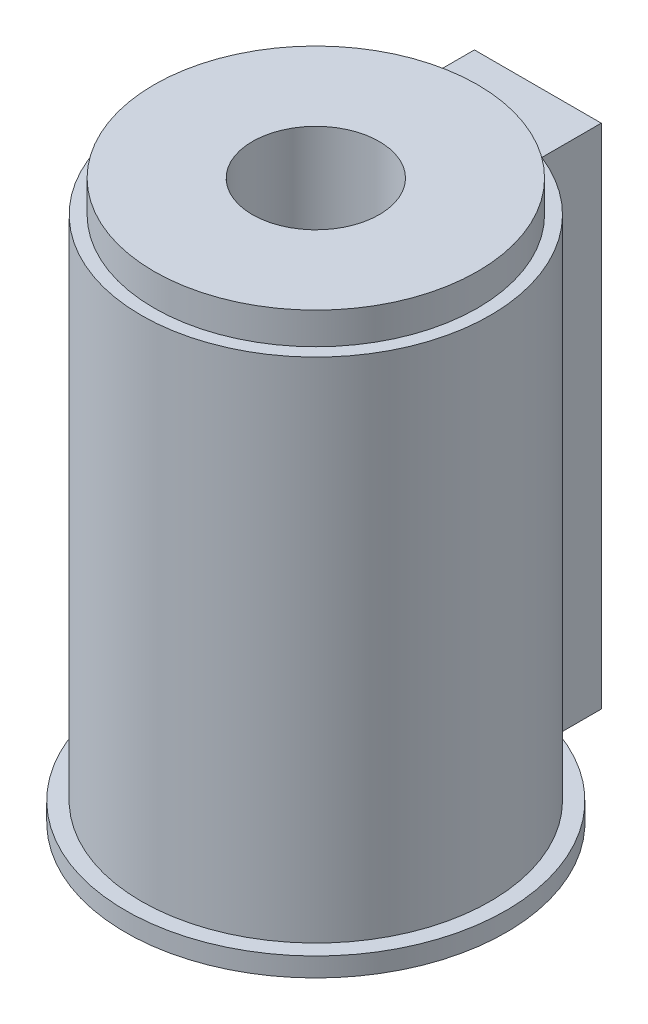
ISO-10303-21;
HEADER;
FILE_DESCRIPTION(('STEP AP214'),'2;1');
FILE_NAME('part.step','',(''),(''),'','','');
FILE_SCHEMA(('AUTOMOTIVE_DESIGN { 1 0 10303 214 1 1 1 1 }'));
ENDSEC;
DATA;
#1=APPLICATION_CONTEXT('core data for automotive mechanical design processes');
#2=APPLICATION_PROTOCOL_DEFINITION('international standard','automotive_design',2000,#1);
#3=PRODUCT_CONTEXT('',#1,'mechanical');
#4=PRODUCT('Part','Part','',(#3));
#5=PRODUCT_RELATED_PRODUCT_CATEGORY('part','',(#4));
#6=PRODUCT_DEFINITION_FORMATION('','',#4);
#7=PRODUCT_DEFINITION_CONTEXT('part definition',#1,'design');
#8=PRODUCT_DEFINITION('design','',#6,#7);
#9=PRODUCT_DEFINITION_SHAPE('','',#8);
#10=(LENGTH_UNIT() NAMED_UNIT(*) SI_UNIT(.MILLI.,.METRE.));
#11=(NAMED_UNIT(*) PLANE_ANGLE_UNIT() SI_UNIT($,.RADIAN.));
#12=(NAMED_UNIT(*) SI_UNIT($,.STERADIAN.) SOLID_ANGLE_UNIT());
#13=UNCERTAINTY_MEASURE_WITH_UNIT(LENGTH_MEASURE(1.E-05),#10,'distance_accuracy_value','');
#14=(GEOMETRIC_REPRESENTATION_CONTEXT(3) GLOBAL_UNCERTAINTY_ASSIGNED_CONTEXT((#13)) GLOBAL_UNIT_ASSIGNED_CONTEXT((#10,
#11,#12)) REPRESENTATION_CONTEXT('',''));
#15=CARTESIAN_POINT('',(0.,0.,0.));
#16=DIRECTION('',(0.,0.,1.));
#17=DIRECTION('',(1.,0.,0.));
#18=AXIS2_PLACEMENT_3D('',#15,#16,#17);
#19=CARTESIAN_POINT('',(0.,800.,0.));
#20=DIRECTION('',(0.,-1.,0.));
#21=DIRECTION('',(0.,0.,-1.));
#22=AXIS2_PLACEMENT_3D('',#19,#20,#21);
#23=CYLINDRICAL_SURFACE('',#22,275.);
#24=CARTESIAN_POINT('',(0.,0.,0.));
#25=DIRECTION('',(0.,1.,0.));
#26=DIRECTION('',(0.,0.,1.));
#27=AXIS2_PLACEMENT_3D('',#24,#25,#26);
#28=CIRCLE('',#27,275.);
#29=CARTESIAN_POINT('',(-100.,0.,-256.17376914899));
#30=VERTEX_POINT('',#29);
#31=CARTESIAN_POINT('',(100.,0.,-256.17376914899));
#32=VERTEX_POINT('',#31);
#33=EDGE_CURVE('E129',#30,#32,#28,.T.);
#34=ORIENTED_EDGE('',*,*,#33,.T.);
#35=DIRECTION('',(0.,-1.,0.));
#36=VECTOR('',#35,1.);
#37=CARTESIAN_POINT('',(100.,800.,-256.17376914899));
#38=LINE('',#37,#36);
#39=CARTESIAN_POINT('',(100.,800.,-256.17376914899));
#40=VERTEX_POINT('',#39);
#41=EDGE_CURVE('E93',#40,#32,#38,.T.);
#42=ORIENTED_EDGE('',*,*,#41,.F.);
#43=CARTESIAN_POINT('',(0.,800.,0.));
#44=DIRECTION('',(0.,1.,0.));
#45=DIRECTION('',(0.,0.,1.));
#46=AXIS2_PLACEMENT_3D('',#43,#44,#45);
#47=CIRCLE('',#46,275.);
#48=CARTESIAN_POINT('',(-100.,800.,-256.17376914899));
#49=VERTEX_POINT('',#48);
#50=EDGE_CURVE('E42',#49,#40,#47,.T.);
#51=ORIENTED_EDGE('',*,*,#50,.F.);
#52=DIRECTION('',(0.,-1.,0.));
#53=VECTOR('',#52,1.);
#54=CARTESIAN_POINT('',(-100.,800.,-256.17376914899));
#55=LINE('',#54,#53);
#56=EDGE_CURVE('E119',#49,#30,#55,.T.);
#57=ORIENTED_EDGE('',*,*,#56,.T.);
#58=EDGE_LOOP('',(#34,#42,#51,#57));
#59=FACE_BOUND('',#58,.T.);
#60=ADVANCED_FACE('F34',(#59),#23,.T.);
#61=CARTESIAN_POINT('',(0.,800.,0.));
#62=DIRECTION('',(0.,1.,0.));
#63=DIRECTION('',(0.,0.,1.));
#64=AXIS2_PLACEMENT_3D('',#61,#62,#63);
#65=PLANE('',#64);
#66=CARTESIAN_POINT('',(0.,800.,0.));
#67=DIRECTION('',(0.,1.,0.));
#68=DIRECTION('',(0.,0.,1.));
#69=AXIS2_PLACEMENT_3D('',#66,#67,#68);
#70=CIRCLE('',#69,255.);
#71=CARTESIAN_POINT('',(0.,800.,255.));
#72=VERTEX_POINT('',#71);
#73=EDGE_CURVE('E108',#72,#72,#70,.T.);
#74=ORIENTED_EDGE('',*,*,#73,.F.);
#75=EDGE_LOOP('',(#74));
#76=FACE_BOUND('',#75,.T.);
#77=ORIENTED_EDGE('',*,*,#50,.T.);
#78=DIRECTION('',(0.,0.,1.));
#79=VECTOR('',#78,1.);
#80=CARTESIAN_POINT('',(99.9999999999999,800.,0.));
#81=LINE('',#80,#79);
#82=CARTESIAN_POINT('',(100.,800.,-350.));
#83=VERTEX_POINT('',#82);
#84=EDGE_CURVE('E112',#83,#40,#81,.T.);
#85=ORIENTED_EDGE('',*,*,#84,.F.);
#86=DIRECTION('',(1.,0.,0.));
#87=VECTOR('',#86,1.);
#88=CARTESIAN_POINT('',(0.,800.,-350.));
#89=LINE('',#88,#87);
#90=CARTESIAN_POINT('',(-100.,800.,-350.));
#91=VERTEX_POINT('',#90);
#92=EDGE_CURVE('E114',#91,#83,#89,.T.);
#93=ORIENTED_EDGE('',*,*,#92,.F.);
#94=DIRECTION('',(0.,0.,1.));
#95=VECTOR('',#94,1.);
#96=CARTESIAN_POINT('',(-99.9999999999999,800.,0.));
#97=LINE('',#96,#95);
#98=EDGE_CURVE('E118',#91,#49,#97,.T.);
#99=ORIENTED_EDGE('',*,*,#98,.T.);
#100=EDGE_LOOP('',(#77,#85,#93,#99));
#101=FACE_BOUND('',#100,.T.);
#102=ADVANCED_FACE('F139',(#76,#101),#65,.T.);
#103=CARTESIAN_POINT('',(0.,0.,0.));
#104=DIRECTION('',(0.,1.,0.));
#105=DIRECTION('',(0.,0.,1.));
#106=AXIS2_PLACEMENT_3D('',#103,#104,#105);
#107=PLANE('',#106);
#108=CARTESIAN_POINT('',(0.,0.,0.));
#109=DIRECTION('',(0.,-1.,0.));
#110=DIRECTION('',(0.,0.,-1.));
#111=AXIS2_PLACEMENT_3D('',#108,#109,#110);
#112=CIRCLE('',#111,300.);
#113=CARTESIAN_POINT('',(-100.,0.,-282.842712474619));
#114=VERTEX_POINT('',#113);
#115=CARTESIAN_POINT('',(100.,0.,-282.842712474619));
#116=VERTEX_POINT('',#115);
#117=EDGE_CURVE('E11',#114,#116,#112,.T.);
#118=ORIENTED_EDGE('',*,*,#117,.F.);
#119=DIRECTION('',(0.,0.,1.));
#120=VECTOR('',#119,1.);
#121=CARTESIAN_POINT('',(-99.9999999999999,0.,0.));
#122=LINE('',#121,#120);
#123=CARTESIAN_POINT('',(-100.,0.,-350.));
#124=VERTEX_POINT('',#123);
#125=EDGE_CURVE('E115',#124,#114,#122,.T.);
#126=ORIENTED_EDGE('',*,*,#125,.F.);
#127=DIRECTION('',(1.,0.,0.));
#128=VECTOR('',#127,1.);
#129=CARTESIAN_POINT('',(0.,0.,-350.));
#130=LINE('',#129,#128);
#131=CARTESIAN_POINT('',(100.,0.,-350.));
#132=VERTEX_POINT('',#131);
#133=EDGE_CURVE('E85',#124,#132,#130,.T.);
#134=ORIENTED_EDGE('',*,*,#133,.T.);
#135=DIRECTION('',(0.,0.,1.));
#136=VECTOR('',#135,1.);
#137=CARTESIAN_POINT('',(99.9999999999999,0.,0.));
#138=LINE('',#137,#136);
#139=EDGE_CURVE('E81',#132,#116,#138,.T.);
#140=ORIENTED_EDGE('',*,*,#139,.T.);
#141=EDGE_LOOP('',(#118,#126,#134,#140));
#142=FACE_BOUND('',#141,.T.);
#143=ADVANCED_FACE('F83',(#142),#107,.F.);
#144=CARTESIAN_POINT('',(99.9999999999999,800.,0.));
#145=DIRECTION('',(1.,0.,0.));
#146=DIRECTION('',(0.,0.,-1.));
#147=AXIS2_PLACEMENT_3D('',#144,#145,#146);
#148=PLANE('',#147);
#149=ORIENTED_EDGE('',*,*,#139,.F.);
#150=DIRECTION('',(0.,-1.,0.));
#151=VECTOR('',#150,1.);
#152=CARTESIAN_POINT('',(100.,800.,-350.));
#153=LINE('',#152,#151);
#154=EDGE_CURVE('E126',#83,#132,#153,.T.);
#155=ORIENTED_EDGE('',*,*,#154,.F.);
#156=ORIENTED_EDGE('',*,*,#84,.T.);
#157=ORIENTED_EDGE('',*,*,#41,.T.);
#158=EDGE_CURVE('E87',#116,#32,#138,.T.);
#159=ORIENTED_EDGE('',*,*,#158,.F.);
#160=EDGE_LOOP('',(#149,#155,#156,#157,#159));
#161=FACE_BOUND('',#160,.T.);
#162=ADVANCED_FACE('F91',(#161),#148,.T.);
#163=CARTESIAN_POINT('',(0.,800.,-350.));
#164=DIRECTION('',(0.,0.,-1.));
#165=DIRECTION('',(-1.,0.,0.));
#166=AXIS2_PLACEMENT_3D('',#163,#164,#165);
#167=PLANE('',#166);
#168=ORIENTED_EDGE('',*,*,#133,.F.);
#169=DIRECTION('',(0.,-1.,0.));
#170=VECTOR('',#169,1.);
#171=CARTESIAN_POINT('',(-100.,800.,-350.));
#172=LINE('',#171,#170);
#173=EDGE_CURVE('E124',#91,#124,#172,.T.);
#174=ORIENTED_EDGE('',*,*,#173,.F.);
#175=ORIENTED_EDGE('',*,*,#92,.T.);
#176=ORIENTED_EDGE('',*,*,#154,.T.);
#177=EDGE_LOOP('',(#168,#174,#175,#176));
#178=FACE_BOUND('',#177,.T.);
#179=ADVANCED_FACE('F136',(#178),#167,.T.);
#180=CARTESIAN_POINT('',(-99.9999999999999,800.,0.));
#181=DIRECTION('',(1.,0.,0.));
#182=DIRECTION('',(0.,0.,-1.));
#183=AXIS2_PLACEMENT_3D('',#180,#181,#182);
#184=PLANE('',#183);
#185=ORIENTED_EDGE('',*,*,#125,.T.);
#186=EDGE_CURVE('E103',#114,#30,#122,.T.);
#187=ORIENTED_EDGE('',*,*,#186,.T.);
#188=ORIENTED_EDGE('',*,*,#56,.F.);
#189=ORIENTED_EDGE('',*,*,#98,.F.);
#190=ORIENTED_EDGE('',*,*,#173,.T.);
#191=EDGE_LOOP('',(#185,#187,#188,#189,#190));
#192=FACE_BOUND('',#191,.T.);
#193=ADVANCED_FACE('F133',(#192),#184,.F.);
#194=CARTESIAN_POINT('',(0.,-30.,0.));
#195=DIRECTION('',(0.,1.,0.));
#196=DIRECTION('',(0.,0.,1.));
#197=AXIS2_PLACEMENT_3D('',#194,#195,#196);
#198=CYLINDRICAL_SURFACE('',#197,300.);
#199=CARTESIAN_POINT('',(0.,-30.,0.));
#200=DIRECTION('',(0.,-1.,0.));
#201=DIRECTION('',(0.,0.,-1.));
#202=AXIS2_PLACEMENT_3D('',#199,#200,#201);
#203=CIRCLE('',#202,300.);
#204=CARTESIAN_POINT('',(0.,-30.,-300.));
#205=VERTEX_POINT('',#204);
#206=EDGE_CURVE('E97',#205,#205,#203,.T.);
#207=ORIENTED_EDGE('',*,*,#206,.F.);
#208=EDGE_LOOP('',(#207));
#209=FACE_BOUND('',#208,.T.);
#210=EDGE_CURVE('E44',#116,#114,#112,.T.);
#211=ORIENTED_EDGE('',*,*,#210,.T.);
#212=ORIENTED_EDGE('',*,*,#117,.T.);
#213=EDGE_LOOP('',(#211,#212));
#214=FACE_BOUND('',#213,.T.);
#215=ADVANCED_FACE('F100',(#209,#214),#198,.T.);
#216=CARTESIAN_POINT('',(0.,-30.,0.));
#217=DIRECTION('',(0.,-1.,0.));
#218=DIRECTION('',(0.,0.,-1.));
#219=AXIS2_PLACEMENT_3D('',#216,#217,#218);
#220=PLANE('',#219);
#221=CARTESIAN_POINT('',(0.,-30.,0.));
#222=DIRECTION('',(0.,1.,0.));
#223=DIRECTION('',(0.,0.,1.));
#224=AXIS2_PLACEMENT_3D('',#221,#222,#223);
#225=CIRCLE('',#224,100.);
#226=CARTESIAN_POINT('',(0.,-30.,100.));
#227=VERTEX_POINT('',#226);
#228=EDGE_CURVE('E182',#227,#227,#225,.T.);
#229=ORIENTED_EDGE('',*,*,#228,.T.);
#230=EDGE_LOOP('',(#229));
#231=FACE_BOUND('',#230,.T.);
#232=ORIENTED_EDGE('',*,*,#206,.T.);
#233=EDGE_LOOP('',(#232));
#234=FACE_BOUND('',#233,.T.);
#235=ADVANCED_FACE('F157',(#231,#234),#220,.T.);
#236=CARTESIAN_POINT('',(0.,0.,0.));
#237=DIRECTION('',(0.,-1.,0.));
#238=DIRECTION('',(0.,0.,-1.));
#239=AXIS2_PLACEMENT_3D('',#236,#237,#238);
#240=PLANE('',#239);
#241=ORIENTED_EDGE('',*,*,#186,.F.);
#242=ORIENTED_EDGE('',*,*,#210,.F.);
#243=ORIENTED_EDGE('',*,*,#158,.T.);
#244=ORIENTED_EDGE('',*,*,#33,.F.);
#245=EDGE_LOOP('',(#241,#242,#243,#244));
#246=FACE_BOUND('',#245,.T.);
#247=ADVANCED_FACE('F102',(#246),#240,.F.);
#248=CARTESIAN_POINT('',(0.,850.,0.));
#249=DIRECTION('',(0.,-1.,0.));
#250=DIRECTION('',(0.,0.,-1.));
#251=AXIS2_PLACEMENT_3D('',#248,#249,#250);
#252=CYLINDRICAL_SURFACE('',#251,255.);
#253=CARTESIAN_POINT('',(0.,850.,0.));
#254=DIRECTION('',(0.,1.,0.));
#255=DIRECTION('',(0.,0.,1.));
#256=AXIS2_PLACEMENT_3D('',#253,#254,#255);
#257=CIRCLE('',#256,255.);
#258=CARTESIAN_POINT('',(0.,850.,255.));
#259=VERTEX_POINT('',#258);
#260=EDGE_CURVE('E104',#259,#259,#257,.T.);
#261=ORIENTED_EDGE('',*,*,#260,.F.);
#262=EDGE_LOOP('',(#261));
#263=FACE_BOUND('',#262,.T.);
#264=ORIENTED_EDGE('',*,*,#73,.T.);
#265=EDGE_LOOP('',(#264));
#266=FACE_BOUND('',#265,.T.);
#267=ADVANCED_FACE('F161',(#263,#266),#252,.T.);
#268=CARTESIAN_POINT('',(0.,850.,0.));
#269=DIRECTION('',(0.,1.,0.));
#270=DIRECTION('',(0.,0.,1.));
#271=AXIS2_PLACEMENT_3D('',#268,#269,#270);
#272=PLANE('',#271);
#273=CARTESIAN_POINT('',(0.,850.,0.));
#274=DIRECTION('',(0.,1.,0.));
#275=DIRECTION('',(0.,0.,1.));
#276=AXIS2_PLACEMENT_3D('',#273,#274,#275);
#277=CIRCLE('',#276,100.);
#278=CARTESIAN_POINT('',(0.,850.,100.));
#279=VERTEX_POINT('',#278);
#280=EDGE_CURVE('E37',#279,#279,#277,.T.);
#281=ORIENTED_EDGE('',*,*,#280,.F.);
#282=EDGE_LOOP('',(#281));
#283=FACE_BOUND('',#282,.T.);
#284=ORIENTED_EDGE('',*,*,#260,.T.);
#285=EDGE_LOOP('',(#284));
#286=FACE_BOUND('',#285,.T.);
#287=ADVANCED_FACE('F167',(#283,#286),#272,.T.);
#288=CARTESIAN_POINT('',(0.,-30.,0.));
#289=DIRECTION('',(0.,1.,0.));
#290=DIRECTION('',(0.,0.,1.));
#291=AXIS2_PLACEMENT_3D('',#288,#289,#290);
#292=CYLINDRICAL_SURFACE('',#291,100.);
#293=ORIENTED_EDGE('',*,*,#280,.T.);
#294=EDGE_LOOP('',(#293));
#295=FACE_BOUND('',#294,.T.);
#296=ORIENTED_EDGE('',*,*,#228,.F.);
#297=EDGE_LOOP('',(#296));
#298=FACE_BOUND('',#297,.T.);
#299=ADVANCED_FACE('F171',(#295,#298),#292,.F.);
#300=CLOSED_SHELL('',(#60,#102,#143,#162,#179,#193,#215,#235,#247,#267,#287,#299));
#301=MANIFOLD_SOLID_BREP('B2',#300);
#302=ADVANCED_BREP_SHAPE_REPRESENTATION('',(#18,#301),#14);
#303=SHAPE_DEFINITION_REPRESENTATION(#9,#302);
ENDSEC;
END-ISO-10303-21;
